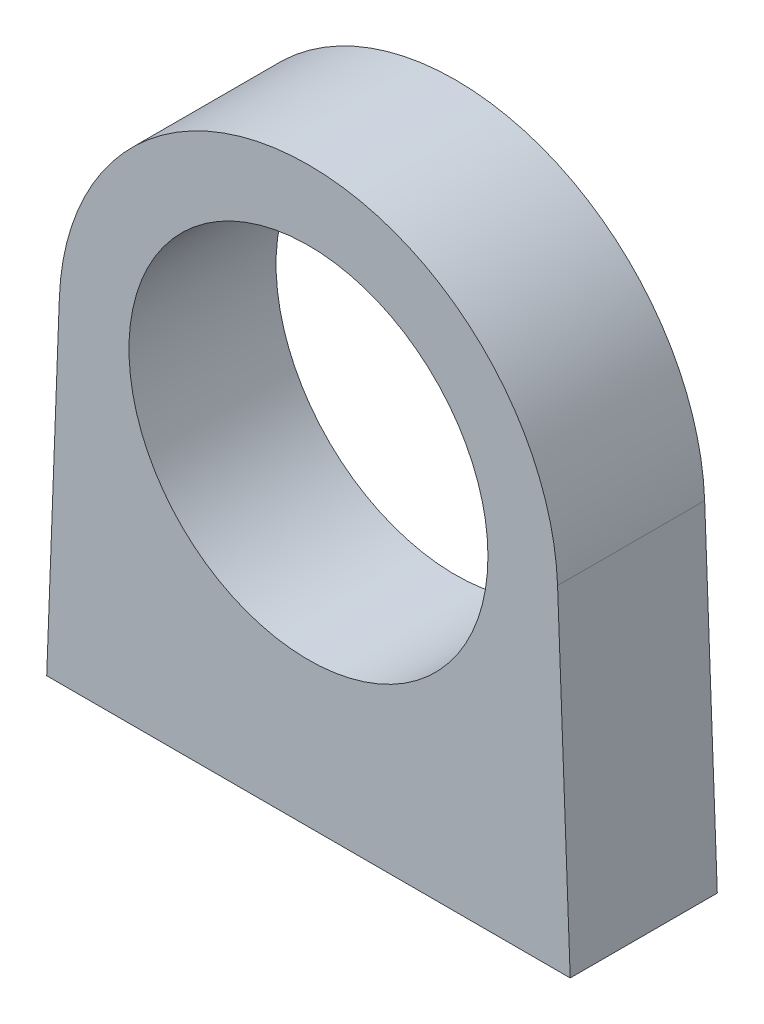
ISO-10303-21;
HEADER;
FILE_DESCRIPTION(('STEP AP214'),'2;1');
FILE_NAME('part.step','',(''),(''),'','','');
FILE_SCHEMA(('AUTOMOTIVE_DESIGN { 1 0 10303 214 1 1 1 1 }'));
ENDSEC;
DATA;
#1=APPLICATION_CONTEXT('core data for automotive mechanical design processes');
#2=APPLICATION_PROTOCOL_DEFINITION('international standard','automotive_design',2000,#1);
#3=PRODUCT_CONTEXT('',#1,'mechanical');
#4=PRODUCT('Part','Part','',(#3));
#5=PRODUCT_RELATED_PRODUCT_CATEGORY('part','',(#4));
#6=PRODUCT_DEFINITION_FORMATION('','',#4);
#7=PRODUCT_DEFINITION_CONTEXT('part definition',#1,'design');
#8=PRODUCT_DEFINITION('design','',#6,#7);
#9=PRODUCT_DEFINITION_SHAPE('','',#8);
#10=(LENGTH_UNIT() NAMED_UNIT(*) SI_UNIT(.MILLI.,.METRE.));
#11=(NAMED_UNIT(*) PLANE_ANGLE_UNIT() SI_UNIT($,.RADIAN.));
#12=(NAMED_UNIT(*) SI_UNIT($,.STERADIAN.) SOLID_ANGLE_UNIT());
#13=UNCERTAINTY_MEASURE_WITH_UNIT(LENGTH_MEASURE(1.E-05),#10,'distance_accuracy_value','');
#14=(GEOMETRIC_REPRESENTATION_CONTEXT(3) GLOBAL_UNCERTAINTY_ASSIGNED_CONTEXT((#13)) GLOBAL_UNIT_ASSIGNED_CONTEXT((#10,
#11,#12)) REPRESENTATION_CONTEXT('',''));
#15=CARTESIAN_POINT('',(0.,0.,0.));
#16=DIRECTION('',(0.,0.,1.));
#17=DIRECTION('',(1.,0.,0.));
#18=AXIS2_PLACEMENT_3D('',#15,#16,#17);
#19=CARTESIAN_POINT('',(0.,13.,2.95));
#20=DIRECTION('',(0.,0.,1.));
#21=DIRECTION('',(1.,0.,0.));
#22=AXIS2_PLACEMENT_3D('',#19,#20,#21);
#23=PLANE('',#22);
#24=CARTESIAN_POINT('',(0.,13.,2.95));
#25=DIRECTION('',(0.,0.,1.));
#26=DIRECTION('',(1.,0.,0.));
#27=AXIS2_PLACEMENT_3D('',#24,#25,#26);
#28=CIRCLE('',#27,9.99999999999999);
#29=CARTESIAN_POINT('',(9.9928222706158,13.3788179878051,2.95));
#30=VERTEX_POINT('',#29);
#31=CARTESIAN_POINT('',(-9.9928222706158,13.3788179878051,2.95));
#32=VERTEX_POINT('',#31);
#33=EDGE_CURVE('E102',#30,#32,#28,.T.);
#34=ORIENTED_EDGE('',*,*,#33,.T.);
#35=DIRECTION('',(-0.0378817987805085,-0.999282227061581,0.));
#36=VECTOR('',#35,1.);
#37=CARTESIAN_POINT('',(-9.9928222706158,13.3788179878051,2.95));
#38=LINE('',#37,#36);
#39=CARTESIAN_POINT('',(-10.5,0.,2.95));
#40=VERTEX_POINT('',#39);
#41=EDGE_CURVE('E97',#32,#40,#38,.T.);
#42=ORIENTED_EDGE('',*,*,#41,.T.);
#43=DIRECTION('',(1.,0.,0.));
#44=VECTOR('',#43,1.);
#45=CARTESIAN_POINT('',(-10.5,0.,2.95));
#46=LINE('',#45,#44);
#47=CARTESIAN_POINT('',(10.5,0.,2.95));
#48=VERTEX_POINT('',#47);
#49=EDGE_CURVE('E100',#40,#48,#46,.T.);
#50=ORIENTED_EDGE('',*,*,#49,.T.);
#51=DIRECTION('',(-0.0378817987805085,0.999282227061581,0.));
#52=VECTOR('',#51,1.);
#53=CARTESIAN_POINT('',(10.5,0.,2.95));
#54=LINE('',#53,#52);
#55=EDGE_CURVE('E67',#48,#30,#54,.T.);
#56=ORIENTED_EDGE('',*,*,#55,.T.);
#57=EDGE_LOOP('',(#34,#42,#50,#56));
#58=FACE_BOUND('',#57,.T.);
#59=CARTESIAN_POINT('',(0.,13.,2.95));
#60=DIRECTION('',(0.,0.,1.));
#61=DIRECTION('',(1.,0.,0.));
#62=AXIS2_PLACEMENT_3D('',#59,#60,#61);
#63=CIRCLE('',#62,7.2);
#64=CARTESIAN_POINT('',(7.2,13.,2.95));
#65=VERTEX_POINT('',#64);
#66=EDGE_CURVE('E122',#65,#65,#63,.T.);
#67=ORIENTED_EDGE('',*,*,#66,.F.);
#68=EDGE_LOOP('',(#67));
#69=FACE_BOUND('',#68,.T.);
#70=ADVANCED_FACE('F49',(#58,#69),#23,.T.);
#71=CARTESIAN_POINT('',(0.,13.,-2.95));
#72=DIRECTION('',(0.,0.,1.));
#73=DIRECTION('',(1.,0.,0.));
#74=AXIS2_PLACEMENT_3D('',#71,#72,#73);
#75=PLANE('',#74);
#76=CARTESIAN_POINT('',(0.,13.,-2.95));
#77=DIRECTION('',(0.,0.,1.));
#78=DIRECTION('',(1.,0.,0.));
#79=AXIS2_PLACEMENT_3D('',#76,#77,#78);
#80=CIRCLE('',#79,9.99999999999999);
#81=CARTESIAN_POINT('',(9.9928222706158,13.3788179878051,-2.95));
#82=VERTEX_POINT('',#81);
#83=CARTESIAN_POINT('',(-9.9928222706158,13.3788179878051,-2.95));
#84=VERTEX_POINT('',#83);
#85=EDGE_CURVE('E118',#82,#84,#80,.T.);
#86=ORIENTED_EDGE('',*,*,#85,.F.);
#87=DIRECTION('',(-0.0378817987805085,0.999282227061581,0.));
#88=VECTOR('',#87,1.);
#89=CARTESIAN_POINT('',(10.5,0.,-2.95));
#90=LINE('',#89,#88);
#91=CARTESIAN_POINT('',(10.5,0.,-2.95));
#92=VERTEX_POINT('',#91);
#93=EDGE_CURVE('E90',#92,#82,#90,.T.);
#94=ORIENTED_EDGE('',*,*,#93,.F.);
#95=DIRECTION('',(1.,0.,0.));
#96=VECTOR('',#95,1.);
#97=CARTESIAN_POINT('',(-10.5,0.,-2.95));
#98=LINE('',#97,#96);
#99=CARTESIAN_POINT('',(-10.5,0.,-2.95));
#100=VERTEX_POINT('',#99);
#101=EDGE_CURVE('E84',#100,#92,#98,.T.);
#102=ORIENTED_EDGE('',*,*,#101,.F.);
#103=DIRECTION('',(-0.0378817987805085,-0.999282227061581,0.));
#104=VECTOR('',#103,1.);
#105=CARTESIAN_POINT('',(-9.9928222706158,13.3788179878051,-2.95));
#106=LINE('',#105,#104);
#107=EDGE_CURVE('E107',#84,#100,#106,.T.);
#108=ORIENTED_EDGE('',*,*,#107,.F.);
#109=EDGE_LOOP('',(#86,#94,#102,#108));
#110=FACE_BOUND('',#109,.T.);
#111=CARTESIAN_POINT('',(0.,13.,-2.95));
#112=DIRECTION('',(0.,0.,1.));
#113=DIRECTION('',(1.,0.,0.));
#114=AXIS2_PLACEMENT_3D('',#111,#112,#113);
#115=CIRCLE('',#114,7.2);
#116=CARTESIAN_POINT('',(7.2,13.,-2.95));
#117=VERTEX_POINT('',#116);
#118=EDGE_CURVE('E140',#117,#117,#115,.T.);
#119=ORIENTED_EDGE('',*,*,#118,.T.);
#120=EDGE_LOOP('',(#119));
#121=FACE_BOUND('',#120,.T.);
#122=ADVANCED_FACE('F135',(#110,#121),#75,.F.);
#123=CARTESIAN_POINT('',(0.,13.,2.95));
#124=DIRECTION('',(0.,0.,-1.));
#125=DIRECTION('',(-1.,0.,0.));
#126=AXIS2_PLACEMENT_3D('',#123,#124,#125);
#127=CYLINDRICAL_SURFACE('',#126,9.99999999999999);
#128=ORIENTED_EDGE('',*,*,#85,.T.);
#129=DIRECTION('',(0.,0.,-1.));
#130=VECTOR('',#129,1.);
#131=CARTESIAN_POINT('',(-9.9928222706158,13.3788179878051,2.95));
#132=LINE('',#131,#130);
#133=EDGE_CURVE('E11',#32,#84,#132,.T.);
#134=ORIENTED_EDGE('',*,*,#133,.F.);
#135=ORIENTED_EDGE('',*,*,#33,.F.);
#136=DIRECTION('',(0.,0.,-1.));
#137=VECTOR('',#136,1.);
#138=CARTESIAN_POINT('',(9.9928222706158,13.3788179878051,2.95));
#139=LINE('',#138,#137);
#140=EDGE_CURVE('E114',#30,#82,#139,.T.);
#141=ORIENTED_EDGE('',*,*,#140,.T.);
#142=EDGE_LOOP('',(#128,#134,#135,#141));
#143=FACE_BOUND('',#142,.T.);
#144=ADVANCED_FACE('F51',(#143),#127,.T.);
#145=CARTESIAN_POINT('',(-9.9928222706158,13.3788179878051,2.95));
#146=DIRECTION('',(0.999282227061581,-0.0378817987805085,0.));
#147=DIRECTION('',(0.0378817987805085,0.999282227061581,0.));
#148=AXIS2_PLACEMENT_3D('',#145,#146,#147);
#149=PLANE('',#148);
#150=ORIENTED_EDGE('',*,*,#107,.T.);
#151=DIRECTION('',(0.,0.,-1.));
#152=VECTOR('',#151,1.);
#153=CARTESIAN_POINT('',(-10.5,0.,2.95));
#154=LINE('',#153,#152);
#155=EDGE_CURVE('E59',#40,#100,#154,.T.);
#156=ORIENTED_EDGE('',*,*,#155,.F.);
#157=ORIENTED_EDGE('',*,*,#41,.F.);
#158=ORIENTED_EDGE('',*,*,#133,.T.);
#159=EDGE_LOOP('',(#150,#156,#157,#158));
#160=FACE_BOUND('',#159,.T.);
#161=ADVANCED_FACE('F106',(#160),#149,.F.);
#162=CARTESIAN_POINT('',(-10.5,0.,2.95));
#163=DIRECTION('',(0.,1.,0.));
#164=DIRECTION('',(0.,0.,1.));
#165=AXIS2_PLACEMENT_3D('',#162,#163,#164);
#166=PLANE('',#165);
#167=CARTESIAN_POINT('',(-6.95,0.,0.));
#168=DIRECTION('',(0.,-1.,0.));
#169=DIRECTION('',(0.,0.,-1.));
#170=AXIS2_PLACEMENT_3D('',#167,#168,#169);
#171=CIRCLE('',#170,1.25);
#172=CARTESIAN_POINT('',(-6.95,0.,-1.25));
#173=VERTEX_POINT('',#172);
#174=EDGE_CURVE('E156',#173,#173,#171,.T.);
#175=ORIENTED_EDGE('',*,*,#174,.F.);
#176=EDGE_LOOP('',(#175));
#177=FACE_BOUND('',#176,.T.);
#178=CARTESIAN_POINT('',(6.95,0.,0.));
#179=DIRECTION('',(0.,-1.,0.));
#180=DIRECTION('',(0.,0.,-1.));
#181=AXIS2_PLACEMENT_3D('',#178,#179,#180);
#182=CIRCLE('',#181,1.25);
#183=CARTESIAN_POINT('',(6.95,0.,-1.25));
#184=VERTEX_POINT('',#183);
#185=EDGE_CURVE('E148',#184,#184,#182,.T.);
#186=ORIENTED_EDGE('',*,*,#185,.F.);
#187=EDGE_LOOP('',(#186));
#188=FACE_BOUND('',#187,.T.);
#189=ORIENTED_EDGE('',*,*,#101,.T.);
#190=DIRECTION('',(0.,0.,-1.));
#191=VECTOR('',#190,1.);
#192=CARTESIAN_POINT('',(10.5,0.,2.95));
#193=LINE('',#192,#191);
#194=EDGE_CURVE('E109',#48,#92,#193,.T.);
#195=ORIENTED_EDGE('',*,*,#194,.F.);
#196=ORIENTED_EDGE('',*,*,#49,.F.);
#197=ORIENTED_EDGE('',*,*,#155,.T.);
#198=EDGE_LOOP('',(#189,#195,#196,#197));
#199=FACE_BOUND('',#198,.T.);
#200=ADVANCED_FACE('F110',(#177,#188,#199),#166,.F.);
#201=CARTESIAN_POINT('',(10.5,0.,2.95));
#202=DIRECTION('',(-0.999282227061581,-0.0378817987805085,0.));
#203=DIRECTION('',(0.0378817987805085,-0.999282227061581,0.));
#204=AXIS2_PLACEMENT_3D('',#201,#202,#203);
#205=PLANE('',#204);
#206=ORIENTED_EDGE('',*,*,#93,.T.);
#207=ORIENTED_EDGE('',*,*,#140,.F.);
#208=ORIENTED_EDGE('',*,*,#55,.F.);
#209=ORIENTED_EDGE('',*,*,#194,.T.);
#210=EDGE_LOOP('',(#206,#207,#208,#209));
#211=FACE_BOUND('',#210,.T.);
#212=ADVANCED_FACE('F132',(#211),#205,.F.);
#213=CARTESIAN_POINT('',(0.,13.,2.95));
#214=DIRECTION('',(0.,0.,-1.));
#215=DIRECTION('',(-1.,0.,0.));
#216=AXIS2_PLACEMENT_3D('',#213,#214,#215);
#217=CYLINDRICAL_SURFACE('',#216,7.2);
#218=ORIENTED_EDGE('',*,*,#66,.T.);
#219=EDGE_LOOP('',(#218));
#220=FACE_BOUND('',#219,.T.);
#221=ORIENTED_EDGE('',*,*,#118,.F.);
#222=EDGE_LOOP('',(#221));
#223=FACE_BOUND('',#222,.T.);
#224=ADVANCED_FACE('F180',(#220,#223),#217,.F.);
#225=CARTESIAN_POINT('',(6.95,5.,0.));
#226=DIRECTION('',(0.,-1.,0.));
#227=DIRECTION('',(0.,0.,-1.));
#228=AXIS2_PLACEMENT_3D('',#225,#226,#227);
#229=CYLINDRICAL_SURFACE('',#228,1.25);
#230=CARTESIAN_POINT('',(6.95,5.,0.));
#231=DIRECTION('',(0.,-1.,0.));
#232=DIRECTION('',(0.,0.,-1.));
#233=AXIS2_PLACEMENT_3D('',#230,#231,#232);
#234=CIRCLE('',#233,1.25);
#235=CARTESIAN_POINT('',(6.95,5.,-1.25));
#236=VERTEX_POINT('',#235);
#237=EDGE_CURVE('E152',#236,#236,#234,.T.);
#238=ORIENTED_EDGE('',*,*,#237,.F.);
#239=EDGE_LOOP('',(#238));
#240=FACE_BOUND('',#239,.T.);
#241=ORIENTED_EDGE('',*,*,#185,.T.);
#242=EDGE_LOOP('',(#241));
#243=FACE_BOUND('',#242,.T.);
#244=ADVANCED_FACE('F178',(#240,#243),#229,.F.);
#245=CARTESIAN_POINT('',(6.95,5.,0.));
#246=DIRECTION('',(0.,-1.,0.));
#247=DIRECTION('',(0.,0.,-1.));
#248=AXIS2_PLACEMENT_3D('',#245,#246,#247);
#249=PLANE('',#248);
#250=ORIENTED_EDGE('',*,*,#237,.T.);
#251=EDGE_LOOP('',(#250));
#252=FACE_BOUND('',#251,.T.);
#253=ADVANCED_FACE('F169',(#252),#249,.T.);
#254=CARTESIAN_POINT('',(-6.95,5.,0.));
#255=DIRECTION('',(0.,-1.,0.));
#256=DIRECTION('',(0.,0.,-1.));
#257=AXIS2_PLACEMENT_3D('',#254,#255,#256);
#258=CYLINDRICAL_SURFACE('',#257,1.25);
#259=CARTESIAN_POINT('',(-6.95,5.,0.));
#260=DIRECTION('',(0.,-1.,0.));
#261=DIRECTION('',(0.,0.,-1.));
#262=AXIS2_PLACEMENT_3D('',#259,#260,#261);
#263=CIRCLE('',#262,1.25);
#264=CARTESIAN_POINT('',(-6.95,5.,-1.25));
#265=VERTEX_POINT('',#264);
#266=EDGE_CURVE('E144',#265,#265,#263,.T.);
#267=ORIENTED_EDGE('',*,*,#266,.F.);
#268=EDGE_LOOP('',(#267));
#269=FACE_BOUND('',#268,.T.);
#270=ORIENTED_EDGE('',*,*,#174,.T.);
#271=EDGE_LOOP('',(#270));
#272=FACE_BOUND('',#271,.T.);
#273=ADVANCED_FACE('F166',(#269,#272),#258,.F.);
#274=CARTESIAN_POINT('',(-6.95,5.,0.));
#275=DIRECTION('',(0.,-1.,0.));
#276=DIRECTION('',(0.,0.,-1.));
#277=AXIS2_PLACEMENT_3D('',#274,#275,#276);
#278=PLANE('',#277);
#279=ORIENTED_EDGE('',*,*,#266,.T.);
#280=EDGE_LOOP('',(#279));
#281=FACE_BOUND('',#280,.T.);
#282=ADVANCED_FACE('F164',(#281),#278,.T.);
#283=CLOSED_SHELL('',(#70,#122,#144,#161,#200,#212,#224,#244,#253,#273,#282));
#284=MANIFOLD_SOLID_BREP('B2',#283);
#285=ADVANCED_BREP_SHAPE_REPRESENTATION('',(#18,#284),#14);
#286=SHAPE_DEFINITION_REPRESENTATION(#9,#285);
ENDSEC;
END-ISO-10303-21;
